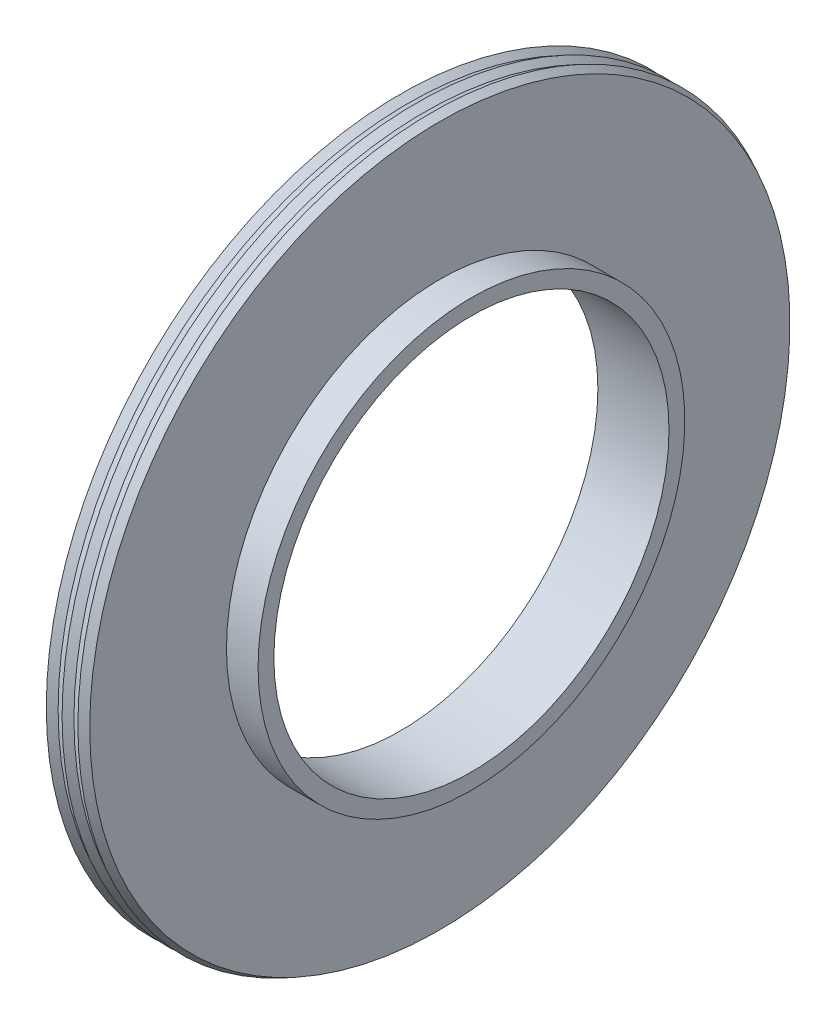
ISO-10303-21;
HEADER;
FILE_DESCRIPTION(('STEP AP214'),'2;1');
FILE_NAME('part.step','',(''),(''),'','','');
FILE_SCHEMA(('AUTOMOTIVE_DESIGN { 1 0 10303 214 1 1 1 1 }'));
ENDSEC;
DATA;
#1=APPLICATION_CONTEXT('core data for automotive mechanical design processes');
#2=APPLICATION_PROTOCOL_DEFINITION('international standard','automotive_design',2000,#1);
#3=PRODUCT_CONTEXT('',#1,'mechanical');
#4=PRODUCT('Part','Part','',(#3));
#5=PRODUCT_RELATED_PRODUCT_CATEGORY('part','',(#4));
#6=PRODUCT_DEFINITION_FORMATION('','',#4);
#7=PRODUCT_DEFINITION_CONTEXT('part definition',#1,'design');
#8=PRODUCT_DEFINITION('design','',#6,#7);
#9=PRODUCT_DEFINITION_SHAPE('','',#8);
#10=(LENGTH_UNIT() NAMED_UNIT(*) SI_UNIT(.MILLI.,.METRE.));
#11=(NAMED_UNIT(*) PLANE_ANGLE_UNIT() SI_UNIT($,.RADIAN.));
#12=(NAMED_UNIT(*) SI_UNIT($,.STERADIAN.) SOLID_ANGLE_UNIT());
#13=UNCERTAINTY_MEASURE_WITH_UNIT(LENGTH_MEASURE(1.E-05),#10,'distance_accuracy_value','');
#14=(GEOMETRIC_REPRESENTATION_CONTEXT(3) GLOBAL_UNCERTAINTY_ASSIGNED_CONTEXT((#13)) GLOBAL_UNIT_ASSIGNED_CONTEXT((#10,
#11,#12)) REPRESENTATION_CONTEXT('',''));
#15=CARTESIAN_POINT('',(0.,0.,0.));
#16=DIRECTION('',(0.,0.,1.));
#17=DIRECTION('',(1.,0.,0.));
#18=AXIS2_PLACEMENT_3D('',#15,#16,#17);
#19=CARTESIAN_POINT('',(2.00000000000002,0.,0.));
#20=DIRECTION('',(-1.,0.,0.));
#21=DIRECTION('',(0.,0.,1.));
#22=AXIS2_PLACEMENT_3D('',#19,#20,#21);
#23=CONICAL_SURFACE('',#22,44.8,0.463647609000824);
#24=CARTESIAN_POINT('',(3.,0.,0.));
#25=DIRECTION('',(-1.,0.,0.));
#26=DIRECTION('',(0.,0.,1.));
#27=AXIS2_PLACEMENT_3D('',#24,#25,#26);
#28=CIRCLE('',#27,44.3);
#29=CARTESIAN_POINT('',(3.,0.,44.3));
#30=VERTEX_POINT('',#29);
#31=EDGE_CURVE('E47',#30,#30,#28,.T.);
#32=ORIENTED_EDGE('',*,*,#31,.T.);
#33=EDGE_LOOP('',(#32));
#34=FACE_BOUND('',#33,.T.);
#35=CARTESIAN_POINT('',(2.00000000000002,0.,0.));
#36=DIRECTION('',(-1.,0.,0.));
#37=DIRECTION('',(0.,0.,1.));
#38=AXIS2_PLACEMENT_3D('',#35,#36,#37);
#39=CIRCLE('',#38,44.8);
#40=CARTESIAN_POINT('',(2.00000000000002,0.,44.8));
#41=VERTEX_POINT('',#40);
#42=EDGE_CURVE('E53',#41,#41,#39,.T.);
#43=ORIENTED_EDGE('',*,*,#42,.F.);
#44=EDGE_LOOP('',(#43));
#45=FACE_BOUND('',#44,.T.);
#46=ADVANCED_FACE('F41',(#34,#45),#23,.T.);
#47=CARTESIAN_POINT('',(3.,0.,0.));
#48=DIRECTION('',(1.,0.,0.));
#49=DIRECTION('',(0.,0.,-1.));
#50=AXIS2_PLACEMENT_3D('',#47,#48,#49);
#51=CONICAL_SURFACE('',#50,44.3,0.46364760900081);
#52=CARTESIAN_POINT('',(4.00000000000002,0.,0.));
#53=DIRECTION('',(-1.,0.,0.));
#54=DIRECTION('',(0.,0.,1.));
#55=AXIS2_PLACEMENT_3D('',#52,#53,#54);
#56=CIRCLE('',#55,44.8);
#57=CARTESIAN_POINT('',(4.00000000000002,0.,44.8));
#58=VERTEX_POINT('',#57);
#59=EDGE_CURVE('E10',#58,#58,#56,.T.);
#60=ORIENTED_EDGE('',*,*,#59,.T.);
#61=EDGE_LOOP('',(#60));
#62=FACE_BOUND('',#61,.T.);
#63=ORIENTED_EDGE('',*,*,#31,.F.);
#64=EDGE_LOOP('',(#63));
#65=FACE_BOUND('',#64,.T.);
#66=ADVANCED_FACE('F86',(#62,#65),#51,.T.);
#67=CARTESIAN_POINT('',(4.00000000000002,0.,0.));
#68=DIRECTION('',(-1.,0.,0.));
#69=DIRECTION('',(0.,0.,1.));
#70=AXIS2_PLACEMENT_3D('',#67,#68,#69);
#71=CONICAL_SURFACE('',#70,44.8,0.463647609000832);
#72=CARTESIAN_POINT('',(5.,0.,0.));
#73=DIRECTION('',(-1.,0.,0.));
#74=DIRECTION('',(0.,0.,1.));
#75=AXIS2_PLACEMENT_3D('',#72,#73,#74);
#76=CIRCLE('',#75,44.3);
#77=CARTESIAN_POINT('',(5.,0.,44.3));
#78=VERTEX_POINT('',#77);
#79=EDGE_CURVE('E61',#78,#78,#76,.T.);
#80=ORIENTED_EDGE('',*,*,#79,.T.);
#81=EDGE_LOOP('',(#80));
#82=FACE_BOUND('',#81,.T.);
#83=ORIENTED_EDGE('',*,*,#59,.F.);
#84=EDGE_LOOP('',(#83));
#85=FACE_BOUND('',#84,.T.);
#86=ADVANCED_FACE('F94',(#82,#85),#71,.T.);
#87=CARTESIAN_POINT('',(5.,0.,0.));
#88=DIRECTION('',(1.,0.,0.));
#89=DIRECTION('',(0.,0.,-1.));
#90=AXIS2_PLACEMENT_3D('',#87,#88,#89);
#91=PLANE('',#90);
#92=CARTESIAN_POINT('',(5.,0.,0.));
#93=DIRECTION('',(-1.,0.,0.));
#94=DIRECTION('',(0.,0.,1.));
#95=AXIS2_PLACEMENT_3D('',#92,#93,#94);
#96=CIRCLE('',#95,27.);
#97=CARTESIAN_POINT('',(5.,0.,27.));
#98=VERTEX_POINT('',#97);
#99=EDGE_CURVE('E68',#98,#98,#96,.T.);
#100=ORIENTED_EDGE('',*,*,#99,.T.);
#101=EDGE_LOOP('',(#100));
#102=FACE_BOUND('',#101,.T.);
#103=ORIENTED_EDGE('',*,*,#79,.F.);
#104=EDGE_LOOP('',(#103));
#105=FACE_BOUND('',#104,.T.);
#106=ADVANCED_FACE('F101',(#102,#105),#91,.T.);
#107=CARTESIAN_POINT('',(1.,0.,0.));
#108=DIRECTION('',(1.,0.,0.));
#109=DIRECTION('',(0.,0.,-1.));
#110=AXIS2_PLACEMENT_3D('',#107,#108,#109);
#111=CONICAL_SURFACE('',#110,44.3,0.463647609000799);
#112=ORIENTED_EDGE('',*,*,#42,.T.);
#113=EDGE_LOOP('',(#112));
#114=FACE_BOUND('',#113,.T.);
#115=CARTESIAN_POINT('',(1.,0.,0.));
#116=DIRECTION('',(-1.,0.,0.));
#117=DIRECTION('',(0.,0.,1.));
#118=AXIS2_PLACEMENT_3D('',#115,#116,#117);
#119=CIRCLE('',#118,44.3);
#120=CARTESIAN_POINT('',(1.,0.,44.3));
#121=VERTEX_POINT('',#120);
#122=EDGE_CURVE('E80',#121,#121,#119,.T.);
#123=ORIENTED_EDGE('',*,*,#122,.F.);
#124=EDGE_LOOP('',(#123));
#125=FACE_BOUND('',#124,.T.);
#126=ADVANCED_FACE('F83',(#114,#125),#111,.T.);
#127=CARTESIAN_POINT('',(0.,0.,0.));
#128=DIRECTION('',(-1.,0.,0.));
#129=DIRECTION('',(0.,0.,1.));
#130=AXIS2_PLACEMENT_3D('',#127,#128,#129);
#131=CONICAL_SURFACE('',#130,44.8,0.4636476090008);
#132=ORIENTED_EDGE('',*,*,#122,.T.);
#133=EDGE_LOOP('',(#132));
#134=FACE_BOUND('',#133,.T.);
#135=CARTESIAN_POINT('',(0.,0.,0.));
#136=DIRECTION('',(-1.,0.,0.));
#137=DIRECTION('',(0.,0.,1.));
#138=AXIS2_PLACEMENT_3D('',#135,#136,#137);
#139=CIRCLE('',#138,44.8);
#140=CARTESIAN_POINT('',(0.,0.,44.8));
#141=VERTEX_POINT('',#140);
#142=EDGE_CURVE('E74',#141,#141,#139,.T.);
#143=ORIENTED_EDGE('',*,*,#142,.F.);
#144=EDGE_LOOP('',(#143));
#145=FACE_BOUND('',#144,.T.);
#146=ADVANCED_FACE('F117',(#134,#145),#131,.T.);
#147=CARTESIAN_POINT('',(0.,0.,0.));
#148=DIRECTION('',(-1.,0.,0.));
#149=DIRECTION('',(0.,0.,1.));
#150=AXIS2_PLACEMENT_3D('',#147,#148,#149);
#151=PLANE('',#150);
#152=ORIENTED_EDGE('',*,*,#142,.T.);
#153=EDGE_LOOP('',(#152));
#154=FACE_BOUND('',#153,.T.);
#155=CARTESIAN_POINT('',(0.,0.,0.));
#156=DIRECTION('',(-1.,0.,0.));
#157=DIRECTION('',(0.,0.,1.));
#158=AXIS2_PLACEMENT_3D('',#155,#156,#157);
#159=CIRCLE('',#158,25.);
#160=CARTESIAN_POINT('',(0.,0.,25.));
#161=VERTEX_POINT('',#160);
#162=EDGE_CURVE('E44',#161,#161,#159,.T.);
#163=ORIENTED_EDGE('',*,*,#162,.F.);
#164=EDGE_LOOP('',(#163));
#165=FACE_BOUND('',#164,.T.);
#166=ADVANCED_FACE('F112',(#154,#165),#151,.T.);
#167=CARTESIAN_POINT('',(-26.2688648413102,0.,0.));
#168=DIRECTION('',(-1.,0.,0.));
#169=DIRECTION('',(0.,0.,1.));
#170=AXIS2_PLACEMENT_3D('',#167,#168,#169);
#171=CYLINDRICAL_SURFACE('',#170,25.);
#172=CARTESIAN_POINT('',(9.,0.,0.));
#173=DIRECTION('',(-1.,0.,0.));
#174=DIRECTION('',(0.,0.,1.));
#175=AXIS2_PLACEMENT_3D('',#172,#173,#174);
#176=CIRCLE('',#175,25.);
#177=CARTESIAN_POINT('',(9.,0.,25.));
#178=VERTEX_POINT('',#177);
#179=EDGE_CURVE('E58',#178,#178,#176,.T.);
#180=ORIENTED_EDGE('',*,*,#179,.F.);
#181=EDGE_LOOP('',(#180));
#182=FACE_BOUND('',#181,.T.);
#183=ORIENTED_EDGE('',*,*,#162,.T.);
#184=EDGE_LOOP('',(#183));
#185=FACE_BOUND('',#184,.T.);
#186=ADVANCED_FACE('F43',(#182,#185),#171,.F.);
#187=CARTESIAN_POINT('',(9.,25.,0.));
#188=DIRECTION('',(-1.,0.,0.));
#189=DIRECTION('',(0.,0.,1.));
#190=AXIS2_PLACEMENT_3D('',#187,#188,#189);
#191=PLANE('',#190);
#192=CARTESIAN_POINT('',(9.,0.,0.));
#193=DIRECTION('',(-1.,0.,0.));
#194=DIRECTION('',(0.,0.,1.));
#195=AXIS2_PLACEMENT_3D('',#192,#193,#194);
#196=CIRCLE('',#195,27.);
#197=CARTESIAN_POINT('',(9.,0.,27.));
#198=VERTEX_POINT('',#197);
#199=EDGE_CURVE('E59',#198,#198,#196,.T.);
#200=ORIENTED_EDGE('',*,*,#199,.F.);
#201=EDGE_LOOP('',(#200));
#202=FACE_BOUND('',#201,.T.);
#203=ORIENTED_EDGE('',*,*,#179,.T.);
#204=EDGE_LOOP('',(#203));
#205=FACE_BOUND('',#204,.T.);
#206=ADVANCED_FACE('F102',(#202,#205),#191,.F.);
#207=CARTESIAN_POINT('',(-26.2688648413102,0.,0.));
#208=DIRECTION('',(-1.,0.,0.));
#209=DIRECTION('',(0.,0.,1.));
#210=AXIS2_PLACEMENT_3D('',#207,#208,#209);
#211=CYLINDRICAL_SURFACE('',#210,27.);
#212=ORIENTED_EDGE('',*,*,#99,.F.);
#213=EDGE_LOOP('',(#212));
#214=FACE_BOUND('',#213,.T.);
#215=ORIENTED_EDGE('',*,*,#199,.T.);
#216=EDGE_LOOP('',(#215));
#217=FACE_BOUND('',#216,.T.);
#218=ADVANCED_FACE('F105',(#214,#217),#211,.T.);
#219=CLOSED_SHELL('',(#46,#66,#86,#106,#126,#146,#166,#186,#206,#218));
#220=MANIFOLD_SOLID_BREP('B2',#219);
#221=ADVANCED_BREP_SHAPE_REPRESENTATION('',(#18,#220),#14);
#222=SHAPE_DEFINITION_REPRESENTATION(#9,#221);
ENDSEC;
END-ISO-10303-21;
